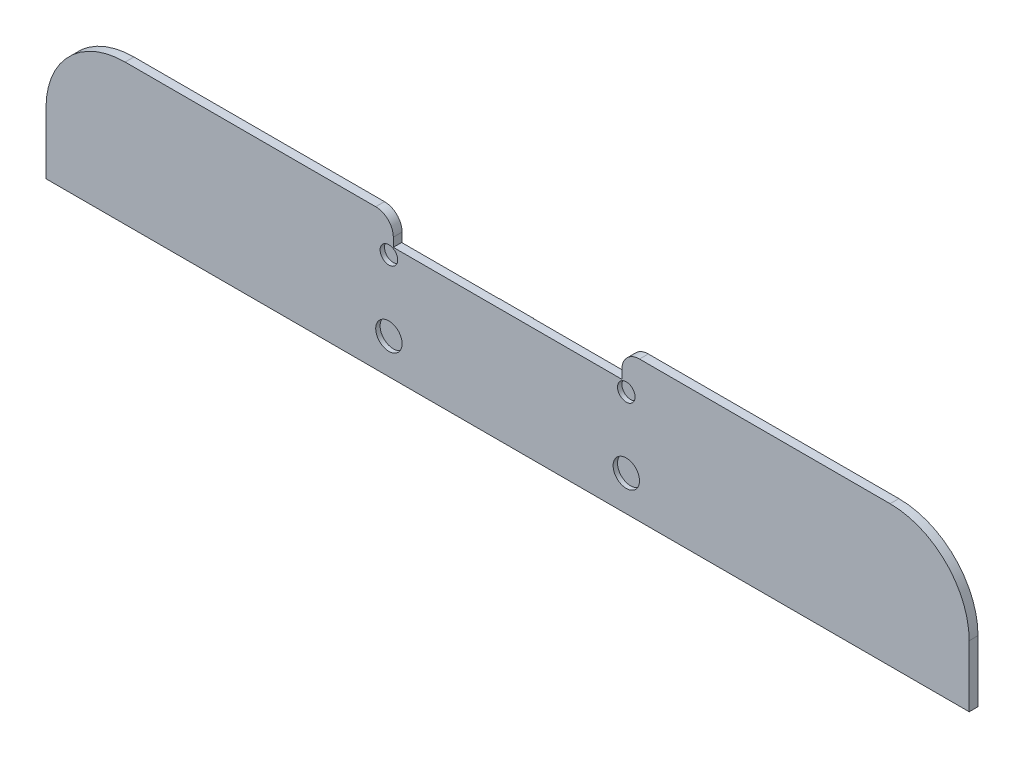
ISO-10303-21;
HEADER;
FILE_DESCRIPTION(('STEP AP214'),'2;1');
FILE_NAME('part.step','',(''),(''),'','','');
FILE_SCHEMA(('AUTOMOTIVE_DESIGN { 1 0 10303 214 1 1 1 1 }'));
ENDSEC;
DATA;
#1=APPLICATION_CONTEXT('core data for automotive mechanical design processes');
#2=APPLICATION_PROTOCOL_DEFINITION('international standard','automotive_design',2000,#1);
#3=PRODUCT_CONTEXT('',#1,'mechanical');
#4=PRODUCT('Part','Part','',(#3));
#5=PRODUCT_RELATED_PRODUCT_CATEGORY('part','',(#4));
#6=PRODUCT_DEFINITION_FORMATION('','',#4);
#7=PRODUCT_DEFINITION_CONTEXT('part definition',#1,'design');
#8=PRODUCT_DEFINITION('design','',#6,#7);
#9=PRODUCT_DEFINITION_SHAPE('','',#8);
#10=(LENGTH_UNIT() NAMED_UNIT(*) SI_UNIT(.MILLI.,.METRE.));
#11=(NAMED_UNIT(*) PLANE_ANGLE_UNIT() SI_UNIT($,.RADIAN.));
#12=(NAMED_UNIT(*) SI_UNIT($,.STERADIAN.) SOLID_ANGLE_UNIT());
#13=UNCERTAINTY_MEASURE_WITH_UNIT(LENGTH_MEASURE(1.E-05),#10,'distance_accuracy_value','');
#14=(GEOMETRIC_REPRESENTATION_CONTEXT(3) GLOBAL_UNCERTAINTY_ASSIGNED_CONTEXT((#13)) GLOBAL_UNIT_ASSIGNED_CONTEXT((#10,
#11,#12)) REPRESENTATION_CONTEXT('',''));
#15=CARTESIAN_POINT('',(0.,0.,0.));
#16=DIRECTION('',(0.,0.,1.));
#17=DIRECTION('',(1.,0.,0.));
#18=AXIS2_PLACEMENT_3D('',#15,#16,#17);
#19=CARTESIAN_POINT('',(0.,0.,0.5));
#20=DIRECTION('',(0.,0.,1.));
#21=DIRECTION('',(1.,0.,0.));
#22=AXIS2_PLACEMENT_3D('',#19,#20,#21);
#23=PLANE('',#22);
#24=DIRECTION('',(-1.,0.,0.));
#25=VECTOR('',#24,1.);
#26=CARTESIAN_POINT('',(-130.,50.,0.5));
#27=LINE('',#26,#25);
#28=CARTESIAN_POINT('',(130.,50.,0.5));
#29=VERTEX_POINT('',#28);
#30=CARTESIAN_POINT('',(20.,50.,0.5));
#31=VERTEX_POINT('',#30);
#32=EDGE_CURVE('E163',#29,#31,#27,.T.);
#33=ORIENTED_EDGE('',*,*,#32,.F.);
#34=DIRECTION('',(0.,1.,0.));
#35=VECTOR('',#34,1.);
#36=CARTESIAN_POINT('',(130.,-80.,0.5));
#37=LINE('',#36,#35);
#38=CARTESIAN_POINT('',(130.,-80.,0.5));
#39=VERTEX_POINT('',#38);
#40=EDGE_CURVE('E203',#39,#29,#37,.T.);
#41=ORIENTED_EDGE('',*,*,#40,.F.);
#42=DIRECTION('',(1.,0.,0.));
#43=VECTOR('',#42,1.);
#44=CARTESIAN_POINT('',(-130.,-80.,0.5));
#45=LINE('',#44,#43);
#46=CARTESIAN_POINT('',(20.,-80.,0.5));
#47=VERTEX_POINT('',#46);
#48=EDGE_CURVE('E204',#47,#39,#45,.T.);
#49=ORIENTED_EDGE('',*,*,#48,.F.);
#50=DIRECTION('',(0.,-1.,0.));
#51=VECTOR('',#50,1.);
#52=CARTESIAN_POINT('',(20.,-80.,0.5));
#53=LINE('',#52,#51);
#54=EDGE_CURVE('E186',#31,#47,#53,.T.);
#55=ORIENTED_EDGE('',*,*,#54,.F.);
#56=EDGE_LOOP('',(#33,#41,#49,#55));
#57=FACE_BOUND('',#56,.T.);
#58=ADVANCED_FACE('F34',(#57),#23,.F.);
#59=CARTESIAN_POINT('',(-20.,50.,0.5));
#60=VERTEX_POINT('',#59);
#61=CARTESIAN_POINT('',(-130.,50.,0.5));
#62=VERTEX_POINT('',#61);
#63=EDGE_CURVE('E610',#60,#62,#27,.T.);
#64=ORIENTED_EDGE('',*,*,#63,.F.);
#65=DIRECTION('',(0.,1.,0.));
#66=VECTOR('',#65,1.);
#67=CARTESIAN_POINT('',(-20.,-80.,0.5));
#68=LINE('',#67,#66);
#69=CARTESIAN_POINT('',(-20.,-80.,0.5));
#70=VERTEX_POINT('',#69);
#71=EDGE_CURVE('E182',#70,#60,#68,.T.);
#72=ORIENTED_EDGE('',*,*,#71,.F.);
#73=CARTESIAN_POINT('',(-130.,-80.,0.5));
#74=VERTEX_POINT('',#73);
#75=EDGE_CURVE('E200',#74,#70,#45,.T.);
#76=ORIENTED_EDGE('',*,*,#75,.F.);
#77=DIRECTION('',(0.,1.,0.));
#78=VECTOR('',#77,1.);
#79=CARTESIAN_POINT('',(-130.,-80.,0.5));
#80=LINE('',#79,#78);
#81=EDGE_CURVE('E207',#74,#62,#80,.T.);
#82=ORIENTED_EDGE('',*,*,#81,.T.);
#83=EDGE_LOOP('',(#64,#72,#76,#82));
#84=FACE_BOUND('',#83,.T.);
#85=ADVANCED_FACE('F335',(#84),#23,.F.);
#86=CARTESIAN_POINT('',(-525.,80.,10.));
#87=DIRECTION('',(0.,1.,0.));
#88=DIRECTION('',(0.,0.,1.));
#89=AXIS2_PLACEMENT_3D('',#86,#87,#88);
#90=PLANE('',#89);
#91=DIRECTION('',(1.,0.,0.));
#92=VECTOR('',#91,1.);
#93=CARTESIAN_POINT('',(-525.,80.,0.));
#94=LINE('',#93,#92);
#95=CARTESIAN_POINT('',(150.,80.,0.));
#96=VERTEX_POINT('',#95);
#97=CARTESIAN_POINT('',(435.,80.,0.));
#98=VERTEX_POINT('',#97);
#99=EDGE_CURVE('E260',#96,#98,#94,.T.);
#100=ORIENTED_EDGE('',*,*,#99,.F.);
#101=DIRECTION('',(0.,0.,-1.));
#102=VECTOR('',#101,1.);
#103=CARTESIAN_POINT('',(150.,80.,10.));
#104=LINE('',#103,#102);
#105=CARTESIAN_POINT('',(150.,80.,10.));
#106=VERTEX_POINT('',#105);
#107=EDGE_CURVE('E297',#96,#106,#104,.F.);
#108=ORIENTED_EDGE('',*,*,#107,.T.);
#109=DIRECTION('',(1.,0.,0.));
#110=VECTOR('',#109,1.);
#111=CARTESIAN_POINT('',(-525.,80.,10.));
#112=LINE('',#111,#110);
#113=CARTESIAN_POINT('',(435.,80.,10.));
#114=VERTEX_POINT('',#113);
#115=EDGE_CURVE('E247',#106,#114,#112,.T.);
#116=ORIENTED_EDGE('',*,*,#115,.T.);
#117=DIRECTION('',(0.,0.,-1.));
#118=VECTOR('',#117,1.);
#119=CARTESIAN_POINT('',(435.,80.,0.));
#120=LINE('',#119,#118);
#121=EDGE_CURVE('E271',#114,#98,#120,.T.);
#122=ORIENTED_EDGE('',*,*,#121,.T.);
#123=EDGE_LOOP('',(#100,#108,#116,#122));
#124=FACE_BOUND('',#123,.T.);
#125=ADVANCED_FACE('F341',(#124),#90,.T.);
#126=CARTESIAN_POINT('',(-525.,-80.,10.));
#127=DIRECTION('',(0.,1.,0.));
#128=DIRECTION('',(0.,0.,1.));
#129=AXIS2_PLACEMENT_3D('',#126,#127,#128);
#130=PLANE('',#129);
#131=DIRECTION('',(0.,0.,-1.));
#132=VECTOR('',#131,1.);
#133=CARTESIAN_POINT('',(130.,-80.,0.5));
#134=LINE('',#133,#132);
#135=CARTESIAN_POINT('',(130.,-80.,0.));
#136=VERTEX_POINT('',#135);
#137=EDGE_CURVE('E216',#39,#136,#134,.T.);
#138=ORIENTED_EDGE('',*,*,#137,.T.);
#139=DIRECTION('',(1.,0.,0.));
#140=VECTOR('',#139,1.);
#141=CARTESIAN_POINT('',(-525.,-80.,0.));
#142=LINE('',#141,#140);
#143=CARTESIAN_POINT('',(525.,-80.,0.));
#144=VERTEX_POINT('',#143);
#145=EDGE_CURVE('E266',#136,#144,#142,.T.);
#146=ORIENTED_EDGE('',*,*,#145,.T.);
#147=DIRECTION('',(0.,0.,-1.));
#148=VECTOR('',#147,1.);
#149=CARTESIAN_POINT('',(525.,-80.,10.));
#150=LINE('',#149,#148);
#151=CARTESIAN_POINT('',(525.,-80.,10.));
#152=VERTEX_POINT('',#151);
#153=EDGE_CURVE('E257',#152,#144,#150,.T.);
#154=ORIENTED_EDGE('',*,*,#153,.F.);
#155=DIRECTION('',(1.,0.,0.));
#156=VECTOR('',#155,1.);
#157=CARTESIAN_POINT('',(-525.,-80.,10.));
#158=LINE('',#157,#156);
#159=CARTESIAN_POINT('',(-525.,-80.,10.));
#160=VERTEX_POINT('',#159);
#161=EDGE_CURVE('E255',#160,#152,#158,.T.);
#162=ORIENTED_EDGE('',*,*,#161,.F.);
#163=DIRECTION('',(0.,0.,-1.));
#164=VECTOR('',#163,1.);
#165=CARTESIAN_POINT('',(-525.,-80.,10.));
#166=LINE('',#165,#164);
#167=CARTESIAN_POINT('',(-525.,-80.,0.));
#168=VERTEX_POINT('',#167);
#169=EDGE_CURVE('E269',#160,#168,#166,.T.);
#170=ORIENTED_EDGE('',*,*,#169,.T.);
#171=CARTESIAN_POINT('',(-130.,-80.,0.));
#172=VERTEX_POINT('',#171);
#173=EDGE_CURVE('E248',#168,#172,#142,.T.);
#174=ORIENTED_EDGE('',*,*,#173,.T.);
#175=DIRECTION('',(0.,0.,-1.));
#176=VECTOR('',#175,1.);
#177=CARTESIAN_POINT('',(-130.,-80.,0.5));
#178=LINE('',#177,#176);
#179=EDGE_CURVE('E210',#74,#172,#178,.T.);
#180=ORIENTED_EDGE('',*,*,#179,.F.);
#181=ORIENTED_EDGE('',*,*,#75,.T.);
#182=DIRECTION('',(0.,0.,1.));
#183=VECTOR('',#182,1.);
#184=CARTESIAN_POINT('',(-20.,-80.,0.25));
#185=LINE('',#184,#183);
#186=CARTESIAN_POINT('',(-20.,-80.,0.25));
#187=VERTEX_POINT('',#186);
#188=EDGE_CURVE('E193',#187,#70,#185,.T.);
#189=ORIENTED_EDGE('',*,*,#188,.F.);
#190=DIRECTION('',(-1.,0.,0.));
#191=VECTOR('',#190,1.);
#192=CARTESIAN_POINT('',(-20.,-80.,0.25));
#193=LINE('',#192,#191);
#194=CARTESIAN_POINT('',(20.,-80.,0.25));
#195=VERTEX_POINT('',#194);
#196=EDGE_CURVE('E181',#195,#187,#193,.T.);
#197=ORIENTED_EDGE('',*,*,#196,.F.);
#198=DIRECTION('',(0.,0.,1.));
#199=VECTOR('',#198,1.);
#200=CARTESIAN_POINT('',(20.,-80.,0.25));
#201=LINE('',#200,#199);
#202=EDGE_CURVE('E180',#195,#47,#201,.T.);
#203=ORIENTED_EDGE('',*,*,#202,.T.);
#204=ORIENTED_EDGE('',*,*,#48,.T.);
#205=EDGE_LOOP('',(#138,#146,#154,#162,#170,#174,#180,#181,#189,#197,#203,#204));
#206=FACE_BOUND('',#205,.T.);
#207=ADVANCED_FACE('F392',(#206),#130,.F.);
#208=CARTESIAN_POINT('',(-435.,80.,10.));
#209=VERTEX_POINT('',#208);
#210=CARTESIAN_POINT('',(-150.,80.,10.));
#211=VERTEX_POINT('',#210);
#212=EDGE_CURVE('E249',#209,#211,#112,.T.);
#213=ORIENTED_EDGE('',*,*,#212,.T.);
#214=DIRECTION('',(0.,0.,-1.));
#215=VECTOR('',#214,1.);
#216=CARTESIAN_POINT('',(-150.,80.,0.));
#217=LINE('',#216,#215);
#218=CARTESIAN_POINT('',(-150.,80.,0.));
#219=VERTEX_POINT('',#218);
#220=EDGE_CURVE('E301',#211,#219,#217,.T.);
#221=ORIENTED_EDGE('',*,*,#220,.T.);
#222=CARTESIAN_POINT('',(-435.,80.,0.));
#223=VERTEX_POINT('',#222);
#224=EDGE_CURVE('E261',#223,#219,#94,.T.);
#225=ORIENTED_EDGE('',*,*,#224,.F.);
#226=DIRECTION('',(0.,0.,-1.));
#227=VECTOR('',#226,1.);
#228=CARTESIAN_POINT('',(-435.,80.,10.));
#229=LINE('',#228,#227);
#230=EDGE_CURVE('E288',#223,#209,#229,.F.);
#231=ORIENTED_EDGE('',*,*,#230,.T.);
#232=EDGE_LOOP('',(#213,#221,#225,#231));
#233=FACE_BOUND('',#232,.T.);
#234=ADVANCED_FACE('F307',(#233),#90,.T.);
#235=CARTESIAN_POINT('',(0.,0.,0.));
#236=DIRECTION('',(0.,0.,-1.));
#237=DIRECTION('',(-1.,0.,0.));
#238=AXIS2_PLACEMENT_3D('',#235,#236,#237);
#239=PLANE('',#238);
#240=DIRECTION('',(0.,1.,0.));
#241=VECTOR('',#240,1.);
#242=CARTESIAN_POINT('',(130.,-80.,0.));
#243=LINE('',#242,#241);
#244=CARTESIAN_POINT('',(130.,60.,0.));
#245=VERTEX_POINT('',#244);
#246=EDGE_CURVE('E199',#136,#245,#243,.T.);
#247=ORIENTED_EDGE('',*,*,#246,.T.);
#248=CARTESIAN_POINT('',(150.,60.,0.));
#249=DIRECTION('',(0.,0.,-1.));
#250=DIRECTION('',(-1.,0.,0.));
#251=AXIS2_PLACEMENT_3D('',#248,#249,#250);
#252=CIRCLE('',#251,20.);
#253=EDGE_CURVE('E295',#245,#96,#252,.T.);
#254=ORIENTED_EDGE('',*,*,#253,.T.);
#255=ORIENTED_EDGE('',*,*,#99,.T.);
#256=CARTESIAN_POINT('',(435.,-9.99999999999998,0.));
#257=DIRECTION('',(0.,0.,-1.));
#258=DIRECTION('',(-1.,0.,0.));
#259=AXIS2_PLACEMENT_3D('',#256,#257,#258);
#260=CIRCLE('',#259,90.);
#261=CARTESIAN_POINT('',(525.,-9.99999999999998,0.));
#262=VERTEX_POINT('',#261);
#263=EDGE_CURVE('E276',#98,#262,#260,.T.);
#264=ORIENTED_EDGE('',*,*,#263,.T.);
#265=DIRECTION('',(0.,1.,0.));
#266=VECTOR('',#265,1.);
#267=CARTESIAN_POINT('',(525.,-80.,0.));
#268=LINE('',#267,#266);
#269=EDGE_CURVE('E263',#144,#262,#268,.T.);
#270=ORIENTED_EDGE('',*,*,#269,.F.);
#271=ORIENTED_EDGE('',*,*,#145,.F.);
#272=EDGE_LOOP('',(#247,#254,#255,#264,#270,#271));
#273=FACE_BOUND('',#272,.T.);
#274=ADVANCED_FACE('F391',(#273),#239,.T.);
#275=CARTESIAN_POINT('',(-525.,-80.,10.));
#276=DIRECTION('',(-1.,0.,0.));
#277=DIRECTION('',(0.,0.,1.));
#278=AXIS2_PLACEMENT_3D('',#275,#276,#277);
#279=PLANE('',#278);
#280=DIRECTION('',(0.,1.,0.));
#281=VECTOR('',#280,1.);
#282=CARTESIAN_POINT('',(-525.,-80.,10.));
#283=LINE('',#282,#281);
#284=CARTESIAN_POINT('',(-525.,-9.99999999999998,10.));
#285=VERTEX_POINT('',#284);
#286=EDGE_CURVE('E244',#160,#285,#283,.T.);
#287=ORIENTED_EDGE('',*,*,#286,.T.);
#288=DIRECTION('',(0.,0.,-1.));
#289=VECTOR('',#288,1.);
#290=CARTESIAN_POINT('',(-525.,-9.99999999999998,10.));
#291=LINE('',#290,#289);
#292=CARTESIAN_POINT('',(-525.,-9.99999999999998,0.));
#293=VERTEX_POINT('',#292);
#294=EDGE_CURVE('E283',#285,#293,#291,.T.);
#295=ORIENTED_EDGE('',*,*,#294,.T.);
#296=DIRECTION('',(0.,1.,0.));
#297=VECTOR('',#296,1.);
#298=CARTESIAN_POINT('',(-525.,-80.,0.));
#299=LINE('',#298,#297);
#300=EDGE_CURVE('E241',#168,#293,#299,.T.);
#301=ORIENTED_EDGE('',*,*,#300,.F.);
#302=ORIENTED_EDGE('',*,*,#169,.F.);
#303=EDGE_LOOP('',(#287,#295,#301,#302));
#304=FACE_BOUND('',#303,.T.);
#305=ADVANCED_FACE('F320',(#304),#279,.T.);
#306=CARTESIAN_POINT('',(525.,-80.,10.));
#307=DIRECTION('',(-1.,0.,0.));
#308=DIRECTION('',(0.,0.,1.));
#309=AXIS2_PLACEMENT_3D('',#306,#307,#308);
#310=PLANE('',#309);
#311=ORIENTED_EDGE('',*,*,#269,.T.);
#312=DIRECTION('',(0.,0.,-1.));
#313=VECTOR('',#312,1.);
#314=CARTESIAN_POINT('',(525.,-9.99999999999998,10.));
#315=LINE('',#314,#313);
#316=CARTESIAN_POINT('',(525.,-9.99999999999998,10.));
#317=VERTEX_POINT('',#316);
#318=EDGE_CURVE('E278',#262,#317,#315,.F.);
#319=ORIENTED_EDGE('',*,*,#318,.T.);
#320=DIRECTION('',(0.,1.,0.));
#321=VECTOR('',#320,1.);
#322=CARTESIAN_POINT('',(525.,-80.,10.));
#323=LINE('',#322,#321);
#324=EDGE_CURVE('E252',#152,#317,#323,.T.);
#325=ORIENTED_EDGE('',*,*,#324,.F.);
#326=ORIENTED_EDGE('',*,*,#153,.T.);
#327=EDGE_LOOP('',(#311,#319,#325,#326));
#328=FACE_BOUND('',#327,.T.);
#329=ADVANCED_FACE('F388',(#328),#310,.F.);
#330=CARTESIAN_POINT('',(0.,0.,10.));
#331=DIRECTION('',(0.,0.,-1.));
#332=DIRECTION('',(-1.,0.,0.));
#333=AXIS2_PLACEMENT_3D('',#330,#331,#332);
#334=PLANE('',#333);
#335=DIRECTION('',(0.,1.,0.));
#336=VECTOR('',#335,1.);
#337=CARTESIAN_POINT('',(-130.,50.,10.));
#338=LINE('',#337,#336);
#339=CARTESIAN_POINT('',(-130.,50.,10.));
#340=VERTEX_POINT('',#339);
#341=CARTESIAN_POINT('',(-130.,60.,10.));
#342=VERTEX_POINT('',#341);
#343=EDGE_CURVE('E189',#340,#342,#338,.T.);
#344=ORIENTED_EDGE('',*,*,#343,.T.);
#345=CARTESIAN_POINT('',(-150.,60.,10.));
#346=DIRECTION('',(0.,0.,-1.));
#347=DIRECTION('',(-1.,0.,0.));
#348=AXIS2_PLACEMENT_3D('',#345,#346,#347);
#349=CIRCLE('',#348,20.);
#350=EDGE_CURVE('E11',#342,#211,#349,.F.);
#351=ORIENTED_EDGE('',*,*,#350,.T.);
#352=ORIENTED_EDGE('',*,*,#212,.F.);
#353=CARTESIAN_POINT('',(-435.,-9.99999999999998,10.));
#354=DIRECTION('',(0.,0.,-1.));
#355=DIRECTION('',(-1.,0.,0.));
#356=AXIS2_PLACEMENT_3D('',#353,#354,#355);
#357=CIRCLE('',#356,90.);
#358=EDGE_CURVE('E290',#209,#285,#357,.F.);
#359=ORIENTED_EDGE('',*,*,#358,.T.);
#360=ORIENTED_EDGE('',*,*,#286,.F.);
#361=ORIENTED_EDGE('',*,*,#161,.T.);
#362=ORIENTED_EDGE('',*,*,#324,.T.);
#363=CARTESIAN_POINT('',(435.,-9.99999999999998,10.));
#364=DIRECTION('',(0.,0.,-1.));
#365=DIRECTION('',(-1.,0.,0.));
#366=AXIS2_PLACEMENT_3D('',#363,#364,#365);
#367=CIRCLE('',#366,90.);
#368=EDGE_CURVE('E280',#317,#114,#367,.F.);
#369=ORIENTED_EDGE('',*,*,#368,.T.);
#370=ORIENTED_EDGE('',*,*,#115,.F.);
#371=CARTESIAN_POINT('',(150.,60.,10.));
#372=DIRECTION('',(0.,0.,-1.));
#373=DIRECTION('',(-1.,0.,0.));
#374=AXIS2_PLACEMENT_3D('',#371,#372,#373);
#375=CIRCLE('',#374,20.);
#376=CARTESIAN_POINT('',(130.,60.,10.));
#377=VERTEX_POINT('',#376);
#378=EDGE_CURVE('E299',#106,#377,#375,.F.);
#379=ORIENTED_EDGE('',*,*,#378,.T.);
#380=DIRECTION('',(0.,1.,0.));
#381=VECTOR('',#380,1.);
#382=CARTESIAN_POINT('',(130.,50.,10.));
#383=LINE('',#382,#381);
#384=CARTESIAN_POINT('',(130.,50.,10.));
#385=VERTEX_POINT('',#384);
#386=EDGE_CURVE('E194',#385,#377,#383,.T.);
#387=ORIENTED_EDGE('',*,*,#386,.F.);
#388=DIRECTION('',(1.,0.,0.));
#389=VECTOR('',#388,1.);
#390=CARTESIAN_POINT('',(-130.,50.,10.));
#391=LINE('',#390,#389);
#392=EDGE_CURVE('E601',#340,#385,#391,.T.);
#393=ORIENTED_EDGE('',*,*,#392,.F.);
#394=EDGE_LOOP('',(#344,#351,#352,#359,#360,#361,#362,#369,#370,#379,#387,#393));
#395=FACE_BOUND('',#394,.T.);
#396=CARTESIAN_POINT('',(-135.,-40.,10.));
#397=DIRECTION('',(0.,0.,1.));
#398=DIRECTION('',(1.,0.,0.));
#399=AXIS2_PLACEMENT_3D('',#396,#397,#398);
#400=CIRCLE('',#399,15.);
#401=CARTESIAN_POINT('',(-120.,-40.,10.));
#402=VERTEX_POINT('',#401);
#403=EDGE_CURVE('E220',#402,#402,#400,.T.);
#404=ORIENTED_EDGE('',*,*,#403,.F.);
#405=EDGE_LOOP('',(#404));
#406=FACE_BOUND('',#405,.T.);
#407=CARTESIAN_POINT('',(135.,-40.,10.));
#408=DIRECTION('',(0.,0.,1.));
#409=DIRECTION('',(1.,0.,0.));
#410=AXIS2_PLACEMENT_3D('',#407,#408,#409);
#411=CIRCLE('',#410,15.);
#412=CARTESIAN_POINT('',(150.,-40.,10.));
#413=VERTEX_POINT('',#412);
#414=EDGE_CURVE('E226',#413,#413,#411,.T.);
#415=ORIENTED_EDGE('',*,*,#414,.F.);
#416=EDGE_LOOP('',(#415));
#417=FACE_BOUND('',#416,.T.);
#418=CARTESIAN_POINT('',(135.,40.,10.));
#419=DIRECTION('',(0.,0.,1.));
#420=DIRECTION('',(1.,0.,0.));
#421=AXIS2_PLACEMENT_3D('',#418,#419,#420);
#422=CIRCLE('',#421,10.);
#423=CARTESIAN_POINT('',(145.,40.,10.));
#424=VERTEX_POINT('',#423);
#425=EDGE_CURVE('E232',#424,#424,#422,.T.);
#426=ORIENTED_EDGE('',*,*,#425,.F.);
#427=EDGE_LOOP('',(#426));
#428=FACE_BOUND('',#427,.T.);
#429=CARTESIAN_POINT('',(-135.,40.,10.));
#430=DIRECTION('',(0.,0.,1.));
#431=DIRECTION('',(1.,0.,0.));
#432=AXIS2_PLACEMENT_3D('',#429,#430,#431);
#433=CIRCLE('',#432,9.99999999999998);
#434=CARTESIAN_POINT('',(-125.,40.,10.));
#435=VERTEX_POINT('',#434);
#436=EDGE_CURVE('E235',#435,#435,#433,.T.);
#437=ORIENTED_EDGE('',*,*,#436,.F.);
#438=EDGE_LOOP('',(#437));
#439=FACE_BOUND('',#438,.T.);
#440=ADVANCED_FACE('F324',(#395,#406,#417,#428,#439),#334,.F.);
#441=ORIENTED_EDGE('',*,*,#224,.T.);
#442=CARTESIAN_POINT('',(-150.,60.,0.));
#443=DIRECTION('',(0.,0.,-1.));
#444=DIRECTION('',(-1.,0.,0.));
#445=AXIS2_PLACEMENT_3D('',#442,#443,#444);
#446=CIRCLE('',#445,20.);
#447=CARTESIAN_POINT('',(-130.,60.,0.));
#448=VERTEX_POINT('',#447);
#449=EDGE_CURVE('E56',#219,#448,#446,.T.);
#450=ORIENTED_EDGE('',*,*,#449,.T.);
#451=DIRECTION('',(0.,1.,0.));
#452=VECTOR('',#451,1.);
#453=CARTESIAN_POINT('',(-130.,-80.,0.));
#454=LINE('',#453,#452);
#455=EDGE_CURVE('E213',#172,#448,#454,.T.);
#456=ORIENTED_EDGE('',*,*,#455,.F.);
#457=ORIENTED_EDGE('',*,*,#173,.F.);
#458=ORIENTED_EDGE('',*,*,#300,.T.);
#459=CARTESIAN_POINT('',(-435.,-9.99999999999998,0.));
#460=DIRECTION('',(0.,0.,-1.));
#461=DIRECTION('',(-1.,0.,0.));
#462=AXIS2_PLACEMENT_3D('',#459,#460,#461);
#463=CIRCLE('',#462,90.);
#464=EDGE_CURVE('E286',#293,#223,#463,.T.);
#465=ORIENTED_EDGE('',*,*,#464,.T.);
#466=EDGE_LOOP('',(#441,#450,#456,#457,#458,#465));
#467=FACE_BOUND('',#466,.T.);
#468=ADVANCED_FACE('F312',(#467),#239,.T.);
#469=CARTESIAN_POINT('',(-135.,40.,5.));
#470=DIRECTION('',(0.,0.,1.));
#471=DIRECTION('',(1.,0.,0.));
#472=AXIS2_PLACEMENT_3D('',#469,#470,#471);
#473=CYLINDRICAL_SURFACE('',#472,9.99999999999998);
#474=CARTESIAN_POINT('',(-135.,40.,5.));
#475=DIRECTION('',(0.,0.,1.));
#476=DIRECTION('',(1.,0.,0.));
#477=AXIS2_PLACEMENT_3D('',#474,#475,#476);
#478=CIRCLE('',#477,9.99999999999998);
#479=CARTESIAN_POINT('',(-125.,40.,5.));
#480=VERTEX_POINT('',#479);
#481=EDGE_CURVE('E238',#480,#480,#478,.T.);
#482=ORIENTED_EDGE('',*,*,#481,.F.);
#483=EDGE_LOOP('',(#482));
#484=FACE_BOUND('',#483,.T.);
#485=ORIENTED_EDGE('',*,*,#436,.T.);
#486=EDGE_LOOP('',(#485));
#487=FACE_BOUND('',#486,.T.);
#488=ADVANCED_FACE('F381',(#484,#487),#473,.F.);
#489=CARTESIAN_POINT('',(0.,0.,5.));
#490=DIRECTION('',(0.,0.,1.));
#491=DIRECTION('',(1.,0.,0.));
#492=AXIS2_PLACEMENT_3D('',#489,#490,#491);
#493=PLANE('',#492);
#494=ORIENTED_EDGE('',*,*,#481,.T.);
#495=EDGE_LOOP('',(#494));
#496=FACE_BOUND('',#495,.T.);
#497=ADVANCED_FACE('F374',(#496),#493,.T.);
#498=CARTESIAN_POINT('',(135.,40.,5.));
#499=DIRECTION('',(0.,0.,1.));
#500=DIRECTION('',(1.,0.,0.));
#501=AXIS2_PLACEMENT_3D('',#498,#499,#500);
#502=CYLINDRICAL_SURFACE('',#501,10.);
#503=CARTESIAN_POINT('',(135.,40.,5.));
#504=DIRECTION('',(0.,0.,1.));
#505=DIRECTION('',(1.,0.,0.));
#506=AXIS2_PLACEMENT_3D('',#503,#504,#505);
#507=CIRCLE('',#506,10.);
#508=CARTESIAN_POINT('',(145.,40.,5.));
#509=VERTEX_POINT('',#508);
#510=EDGE_CURVE('E229',#509,#509,#507,.T.);
#511=ORIENTED_EDGE('',*,*,#510,.F.);
#512=EDGE_LOOP('',(#511));
#513=FACE_BOUND('',#512,.T.);
#514=ORIENTED_EDGE('',*,*,#425,.T.);
#515=EDGE_LOOP('',(#514));
#516=FACE_BOUND('',#515,.T.);
#517=ADVANCED_FACE('F371',(#513,#516),#502,.F.);
#518=CARTESIAN_POINT('',(0.,0.,5.));
#519=DIRECTION('',(0.,0.,1.));
#520=DIRECTION('',(1.,0.,0.));
#521=AXIS2_PLACEMENT_3D('',#518,#519,#520);
#522=PLANE('',#521);
#523=ORIENTED_EDGE('',*,*,#510,.T.);
#524=EDGE_LOOP('',(#523));
#525=FACE_BOUND('',#524,.T.);
#526=ADVANCED_FACE('F366',(#525),#522,.T.);
#527=CARTESIAN_POINT('',(135.,-40.,5.));
#528=DIRECTION('',(0.,0.,1.));
#529=DIRECTION('',(1.,0.,0.));
#530=AXIS2_PLACEMENT_3D('',#527,#528,#529);
#531=CYLINDRICAL_SURFACE('',#530,15.);
#532=CARTESIAN_POINT('',(135.,-40.,5.));
#533=DIRECTION('',(0.,0.,1.));
#534=DIRECTION('',(1.,0.,0.));
#535=AXIS2_PLACEMENT_3D('',#532,#533,#534);
#536=CIRCLE('',#535,15.);
#537=CARTESIAN_POINT('',(150.,-40.,5.));
#538=VERTEX_POINT('',#537);
#539=EDGE_CURVE('E223',#538,#538,#536,.T.);
#540=ORIENTED_EDGE('',*,*,#539,.F.);
#541=EDGE_LOOP('',(#540));
#542=FACE_BOUND('',#541,.T.);
#543=ORIENTED_EDGE('',*,*,#414,.T.);
#544=EDGE_LOOP('',(#543));
#545=FACE_BOUND('',#544,.T.);
#546=ADVANCED_FACE('F363',(#542,#545),#531,.F.);
#547=CARTESIAN_POINT('',(0.,0.,5.));
#548=DIRECTION('',(0.,0.,1.));
#549=DIRECTION('',(1.,0.,0.));
#550=AXIS2_PLACEMENT_3D('',#547,#548,#549);
#551=PLANE('',#550);
#552=ORIENTED_EDGE('',*,*,#539,.T.);
#553=EDGE_LOOP('',(#552));
#554=FACE_BOUND('',#553,.T.);
#555=ADVANCED_FACE('F357',(#554),#551,.T.);
#556=CARTESIAN_POINT('',(-135.,-40.,5.));
#557=DIRECTION('',(0.,0.,1.));
#558=DIRECTION('',(1.,0.,0.));
#559=AXIS2_PLACEMENT_3D('',#556,#557,#558);
#560=CYLINDRICAL_SURFACE('',#559,15.);
#561=CARTESIAN_POINT('',(-135.,-40.,5.));
#562=DIRECTION('',(0.,0.,1.));
#563=DIRECTION('',(1.,0.,0.));
#564=AXIS2_PLACEMENT_3D('',#561,#562,#563);
#565=CIRCLE('',#564,15.);
#566=CARTESIAN_POINT('',(-120.,-40.,5.));
#567=VERTEX_POINT('',#566);
#568=EDGE_CURVE('E219',#567,#567,#565,.T.);
#569=ORIENTED_EDGE('',*,*,#568,.F.);
#570=EDGE_LOOP('',(#569));
#571=FACE_BOUND('',#570,.T.);
#572=ORIENTED_EDGE('',*,*,#403,.T.);
#573=EDGE_LOOP('',(#572));
#574=FACE_BOUND('',#573,.T.);
#575=ADVANCED_FACE('F353',(#571,#574),#560,.F.);
#576=CARTESIAN_POINT('',(-135.,-40.,5.));
#577=DIRECTION('',(0.,0.,1.));
#578=DIRECTION('',(1.,0.,0.));
#579=AXIS2_PLACEMENT_3D('',#576,#577,#578);
#580=PLANE('',#579);
#581=ORIENTED_EDGE('',*,*,#568,.T.);
#582=EDGE_LOOP('',(#581));
#583=FACE_BOUND('',#582,.T.);
#584=ADVANCED_FACE('F356',(#583),#580,.T.);
#585=CARTESIAN_POINT('',(435.,-9.99999999999998,10.));
#586=DIRECTION('',(0.,0.,1.));
#587=DIRECTION('',(1.,0.,0.));
#588=AXIS2_PLACEMENT_3D('',#585,#586,#587);
#589=CYLINDRICAL_SURFACE('',#588,90.);
#590=ORIENTED_EDGE('',*,*,#368,.F.);
#591=ORIENTED_EDGE('',*,*,#318,.F.);
#592=ORIENTED_EDGE('',*,*,#263,.F.);
#593=ORIENTED_EDGE('',*,*,#121,.F.);
#594=EDGE_LOOP('',(#590,#591,#592,#593));
#595=FACE_BOUND('',#594,.T.);
#596=ADVANCED_FACE('F361',(#595),#589,.T.);
#597=CARTESIAN_POINT('',(-435.,-9.99999999999998,10.));
#598=DIRECTION('',(0.,0.,-1.));
#599=DIRECTION('',(-1.,0.,0.));
#600=AXIS2_PLACEMENT_3D('',#597,#598,#599);
#601=CYLINDRICAL_SURFACE('',#600,90.);
#602=ORIENTED_EDGE('',*,*,#358,.F.);
#603=ORIENTED_EDGE('',*,*,#230,.F.);
#604=ORIENTED_EDGE('',*,*,#464,.F.);
#605=ORIENTED_EDGE('',*,*,#294,.F.);
#606=EDGE_LOOP('',(#602,#603,#604,#605));
#607=FACE_BOUND('',#606,.T.);
#608=ADVANCED_FACE('F318',(#607),#601,.T.);
#609=CARTESIAN_POINT('',(130.,-80.,0.5));
#610=DIRECTION('',(-1.,0.,0.));
#611=DIRECTION('',(0.,0.,1.));
#612=AXIS2_PLACEMENT_3D('',#609,#610,#611);
#613=PLANE('',#612);
#614=ORIENTED_EDGE('',*,*,#386,.T.);
#615=DIRECTION('',(0.,0.,-1.));
#616=VECTOR('',#615,1.);
#617=CARTESIAN_POINT('',(130.,60.,0.5));
#618=LINE('',#617,#616);
#619=EDGE_CURVE('E292',#377,#245,#618,.T.);
#620=ORIENTED_EDGE('',*,*,#619,.T.);
#621=ORIENTED_EDGE('',*,*,#246,.F.);
#622=ORIENTED_EDGE('',*,*,#137,.F.);
#623=ORIENTED_EDGE('',*,*,#40,.T.);
#624=DIRECTION('',(0.,0.,-1.));
#625=VECTOR('',#624,1.);
#626=CARTESIAN_POINT('',(130.,50.,10.));
#627=LINE('',#626,#625);
#628=EDGE_CURVE('E599',#385,#29,#627,.T.);
#629=ORIENTED_EDGE('',*,*,#628,.F.);
#630=EDGE_LOOP('',(#614,#620,#621,#622,#623,#629));
#631=FACE_BOUND('',#630,.T.);
#632=ADVANCED_FACE('F349',(#631),#613,.T.);
#633=CARTESIAN_POINT('',(-130.,-80.,0.5));
#634=DIRECTION('',(-1.,0.,0.));
#635=DIRECTION('',(0.,0.,1.));
#636=AXIS2_PLACEMENT_3D('',#633,#634,#635);
#637=PLANE('',#636);
#638=ORIENTED_EDGE('',*,*,#455,.T.);
#639=DIRECTION('',(0.,0.,-1.));
#640=VECTOR('',#639,1.);
#641=CARTESIAN_POINT('',(-130.,60.,10.));
#642=LINE('',#641,#640);
#643=EDGE_CURVE('E42',#448,#342,#642,.F.);
#644=ORIENTED_EDGE('',*,*,#643,.T.);
#645=ORIENTED_EDGE('',*,*,#343,.F.);
#646=DIRECTION('',(0.,0.,1.));
#647=VECTOR('',#646,1.);
#648=CARTESIAN_POINT('',(-130.,50.,0.5));
#649=LINE('',#648,#647);
#650=EDGE_CURVE('E607',#62,#340,#649,.T.);
#651=ORIENTED_EDGE('',*,*,#650,.F.);
#652=ORIENTED_EDGE('',*,*,#81,.F.);
#653=ORIENTED_EDGE('',*,*,#179,.T.);
#654=EDGE_LOOP('',(#638,#644,#645,#651,#652,#653));
#655=FACE_BOUND('',#654,.T.);
#656=ADVANCED_FACE('F346',(#655),#637,.F.);
#657=CARTESIAN_POINT('',(20.,-80.,0.25));
#658=DIRECTION('',(-1.,0.,0.));
#659=DIRECTION('',(0.,0.,1.));
#660=AXIS2_PLACEMENT_3D('',#657,#658,#659);
#661=PLANE('',#660);
#662=DIRECTION('',(0.,-1.,0.));
#663=VECTOR('',#662,1.);
#664=CARTESIAN_POINT('',(20.,-80.,0.25));
#665=LINE('',#664,#663);
#666=CARTESIAN_POINT('',(20.,50.,0.25));
#667=VERTEX_POINT('',#666);
#668=EDGE_CURVE('E172',#667,#195,#665,.T.);
#669=ORIENTED_EDGE('',*,*,#668,.F.);
#670=DIRECTION('',(0.,0.,-1.));
#671=VECTOR('',#670,1.);
#672=CARTESIAN_POINT('',(20.,50.,30.25));
#673=LINE('',#672,#671);
#674=EDGE_CURVE('E157',#31,#667,#673,.T.);
#675=ORIENTED_EDGE('',*,*,#674,.F.);
#676=ORIENTED_EDGE('',*,*,#54,.T.);
#677=ORIENTED_EDGE('',*,*,#202,.F.);
#678=EDGE_LOOP('',(#669,#675,#676,#677));
#679=FACE_BOUND('',#678,.T.);
#680=ADVANCED_FACE('F178',(#679),#661,.F.);
#681=CARTESIAN_POINT('',(-20.,-80.,0.25));
#682=DIRECTION('',(1.,0.,0.));
#683=DIRECTION('',(0.,0.,-1.));
#684=AXIS2_PLACEMENT_3D('',#681,#682,#683);
#685=PLANE('',#684);
#686=ORIENTED_EDGE('',*,*,#71,.T.);
#687=DIRECTION('',(0.,0.,-1.));
#688=VECTOR('',#687,1.);
#689=CARTESIAN_POINT('',(-20.,50.,30.25));
#690=LINE('',#689,#688);
#691=CARTESIAN_POINT('',(-20.,50.,0.25));
#692=VERTEX_POINT('',#691);
#693=EDGE_CURVE('E167',#60,#692,#690,.T.);
#694=ORIENTED_EDGE('',*,*,#693,.T.);
#695=DIRECTION('',(0.,1.,0.));
#696=VECTOR('',#695,1.);
#697=CARTESIAN_POINT('',(-20.,-80.,0.25));
#698=LINE('',#697,#696);
#699=EDGE_CURVE('E175',#187,#692,#698,.T.);
#700=ORIENTED_EDGE('',*,*,#699,.F.);
#701=ORIENTED_EDGE('',*,*,#188,.T.);
#702=EDGE_LOOP('',(#686,#694,#700,#701));
#703=FACE_BOUND('',#702,.T.);
#704=ADVANCED_FACE('F430',(#703),#685,.F.);
#705=CARTESIAN_POINT('',(0.,0.,0.25));
#706=DIRECTION('',(0.,0.,-1.));
#707=DIRECTION('',(-1.,0.,0.));
#708=AXIS2_PLACEMENT_3D('',#705,#706,#707);
#709=PLANE('',#708);
#710=DIRECTION('',(-1.,0.,0.));
#711=VECTOR('',#710,1.);
#712=CARTESIAN_POINT('',(-20.,50.,0.25));
#713=LINE('',#712,#711);
#714=EDGE_CURVE('E160',#667,#692,#713,.T.);
#715=ORIENTED_EDGE('',*,*,#714,.F.);
#716=ORIENTED_EDGE('',*,*,#668,.T.);
#717=ORIENTED_EDGE('',*,*,#196,.T.);
#718=ORIENTED_EDGE('',*,*,#699,.T.);
#719=EDGE_LOOP('',(#715,#716,#717,#718));
#720=FACE_BOUND('',#719,.T.);
#721=ADVANCED_FACE('F171',(#720),#709,.T.);
#722=CARTESIAN_POINT('',(0.,50.,0.));
#723=DIRECTION('',(0.,1.,0.));
#724=DIRECTION('',(0.,0.,1.));
#725=AXIS2_PLACEMENT_3D('',#722,#723,#724);
#726=PLANE('',#725);
#727=ORIENTED_EDGE('',*,*,#32,.T.);
#728=ORIENTED_EDGE('',*,*,#674,.T.);
#729=ORIENTED_EDGE('',*,*,#714,.T.);
#730=ORIENTED_EDGE('',*,*,#693,.F.);
#731=ORIENTED_EDGE('',*,*,#63,.T.);
#732=ORIENTED_EDGE('',*,*,#650,.T.);
#733=ORIENTED_EDGE('',*,*,#392,.T.);
#734=ORIENTED_EDGE('',*,*,#628,.T.);
#735=EDGE_LOOP('',(#727,#728,#729,#730,#731,#732,#733,#734));
#736=FACE_BOUND('',#735,.T.);
#737=ADVANCED_FACE('F159',(#736),#726,.T.);
#738=CARTESIAN_POINT('',(150.,60.,0.5));
#739=DIRECTION('',(0.,0.,-1.));
#740=DIRECTION('',(-1.,0.,0.));
#741=AXIS2_PLACEMENT_3D('',#738,#739,#740);
#742=CYLINDRICAL_SURFACE('',#741,20.);
#743=ORIENTED_EDGE('',*,*,#378,.F.);
#744=ORIENTED_EDGE('',*,*,#107,.F.);
#745=ORIENTED_EDGE('',*,*,#253,.F.);
#746=ORIENTED_EDGE('',*,*,#619,.F.);
#747=EDGE_LOOP('',(#743,#744,#745,#746));
#748=FACE_BOUND('',#747,.T.);
#749=ADVANCED_FACE('F329',(#748),#742,.T.);
#750=CARTESIAN_POINT('',(-150.,60.,10.));
#751=DIRECTION('',(0.,0.,1.));
#752=DIRECTION('',(1.,0.,0.));
#753=AXIS2_PLACEMENT_3D('',#750,#751,#752);
#754=CYLINDRICAL_SURFACE('',#753,20.);
#755=ORIENTED_EDGE('',*,*,#350,.F.);
#756=ORIENTED_EDGE('',*,*,#643,.F.);
#757=ORIENTED_EDGE('',*,*,#449,.F.);
#758=ORIENTED_EDGE('',*,*,#220,.F.);
#759=EDGE_LOOP('',(#755,#756,#757,#758));
#760=FACE_BOUND('',#759,.T.);
#761=ADVANCED_FACE('F36',(#760),#754,.T.);
#762=CLOSED_SHELL('',(#58,#85,#125,#207,#234,#274,#305,#329,#440,#468,#488,#497,#517,#526,#546,
#555,#575,#584,#596,#608,#632,#656,#680,#704,#721,#737,#749,#761));
#763=MANIFOLD_SOLID_BREP('B2',#762);
#764=ADVANCED_BREP_SHAPE_REPRESENTATION('',(#18,#763),#14);
#765=SHAPE_DEFINITION_REPRESENTATION(#9,#764);
ENDSEC;
END-ISO-10303-21;
